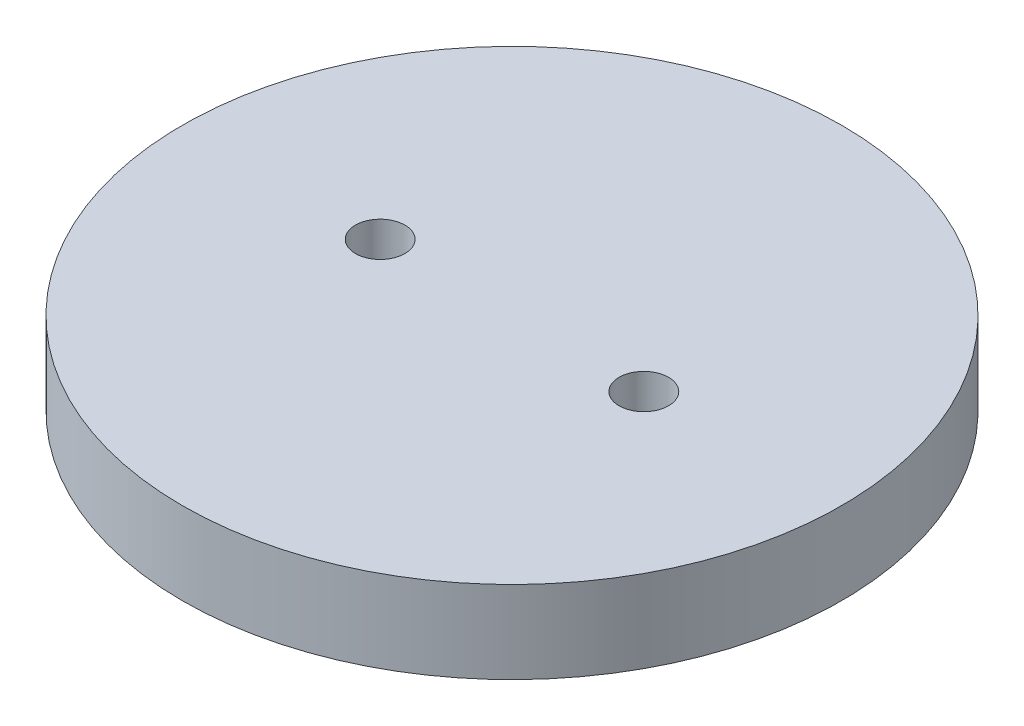
ISO-10303-21;
HEADER;
FILE_DESCRIPTION(('STEP AP214'),'2;1');
FILE_NAME('part.step','',(''),(''),'','','');
FILE_SCHEMA(('AUTOMOTIVE_DESIGN { 1 0 10303 214 1 1 1 1 }'));
ENDSEC;
DATA;
#1=APPLICATION_CONTEXT('core data for automotive mechanical design processes');
#2=APPLICATION_PROTOCOL_DEFINITION('international standard','automotive_design',2000,#1);
#3=PRODUCT_CONTEXT('',#1,'mechanical');
#4=PRODUCT('Part','Part','',(#3));
#5=PRODUCT_RELATED_PRODUCT_CATEGORY('part','',(#4));
#6=PRODUCT_DEFINITION_FORMATION('','',#4);
#7=PRODUCT_DEFINITION_CONTEXT('part definition',#1,'design');
#8=PRODUCT_DEFINITION('design','',#6,#7);
#9=PRODUCT_DEFINITION_SHAPE('','',#8);
#10=(LENGTH_UNIT() NAMED_UNIT(*) SI_UNIT(.MILLI.,.METRE.));
#11=(NAMED_UNIT(*) PLANE_ANGLE_UNIT() SI_UNIT($,.RADIAN.));
#12=(NAMED_UNIT(*) SI_UNIT($,.STERADIAN.) SOLID_ANGLE_UNIT());
#13=UNCERTAINTY_MEASURE_WITH_UNIT(LENGTH_MEASURE(1.E-05),#10,'distance_accuracy_value','');
#14=(GEOMETRIC_REPRESENTATION_CONTEXT(3) GLOBAL_UNCERTAINTY_ASSIGNED_CONTEXT((#13)) GLOBAL_UNIT_ASSIGNED_CONTEXT((#10,
#11,#12)) REPRESENTATION_CONTEXT('',''));
#15=CARTESIAN_POINT('',(0.,0.,0.));
#16=DIRECTION('',(0.,0.,1.));
#17=DIRECTION('',(1.,0.,0.));
#18=AXIS2_PLACEMENT_3D('',#15,#16,#17);
#19=CARTESIAN_POINT('',(0.,5.,0.));
#20=DIRECTION('',(0.,-1.,0.));
#21=DIRECTION('',(0.,0.,-1.));
#22=AXIS2_PLACEMENT_3D('',#19,#20,#21);
#23=CYLINDRICAL_SURFACE('',#22,20.);
#24=CARTESIAN_POINT('',(0.,5.,0.));
#25=DIRECTION('',(0.,1.,0.));
#26=DIRECTION('',(0.,0.,1.));
#27=AXIS2_PLACEMENT_3D('',#24,#25,#26);
#28=CIRCLE('',#27,20.);
#29=CARTESIAN_POINT('',(0.,5.,20.));
#30=VERTEX_POINT('',#29);
#31=EDGE_CURVE('E10',#30,#30,#28,.T.);
#32=ORIENTED_EDGE('',*,*,#31,.F.);
#33=EDGE_LOOP('',(#32));
#34=FACE_BOUND('',#33,.T.);
#35=CARTESIAN_POINT('',(0.,0.,0.));
#36=DIRECTION('',(0.,1.,0.));
#37=DIRECTION('',(0.,0.,1.));
#38=AXIS2_PLACEMENT_3D('',#35,#36,#37);
#39=CIRCLE('',#38,20.);
#40=CARTESIAN_POINT('',(0.,0.,20.));
#41=VERTEX_POINT('',#40);
#42=EDGE_CURVE('E37',#41,#41,#39,.T.);
#43=ORIENTED_EDGE('',*,*,#42,.T.);
#44=EDGE_LOOP('',(#43));
#45=FACE_BOUND('',#44,.T.);
#46=ADVANCED_FACE('F34',(#34,#45),#23,.T.);
#47=CARTESIAN_POINT('',(0.,5.,0.));
#48=DIRECTION('',(0.,1.,0.));
#49=DIRECTION('',(0.,0.,1.));
#50=AXIS2_PLACEMENT_3D('',#47,#48,#49);
#51=PLANE('',#50);
#52=CARTESIAN_POINT('',(8.,5.,0.));
#53=DIRECTION('',(0.,1.,0.));
#54=DIRECTION('',(0.,0.,1.));
#55=AXIS2_PLACEMENT_3D('',#52,#53,#54);
#56=CIRCLE('',#55,1.5);
#57=CARTESIAN_POINT('',(8.,5.,1.5));
#58=VERTEX_POINT('',#57);
#59=EDGE_CURVE('E52',#58,#58,#56,.T.);
#60=ORIENTED_EDGE('',*,*,#59,.F.);
#61=EDGE_LOOP('',(#60));
#62=FACE_BOUND('',#61,.T.);
#63=CARTESIAN_POINT('',(-8.,5.,0.));
#64=DIRECTION('',(0.,1.,0.));
#65=DIRECTION('',(0.,0.,1.));
#66=AXIS2_PLACEMENT_3D('',#63,#64,#65);
#67=CIRCLE('',#66,1.5);
#68=CARTESIAN_POINT('',(-8.,5.,1.49999999999999));
#69=VERTEX_POINT('',#68);
#70=EDGE_CURVE('E46',#69,#69,#67,.T.);
#71=ORIENTED_EDGE('',*,*,#70,.F.);
#72=EDGE_LOOP('',(#71));
#73=FACE_BOUND('',#72,.T.);
#74=ORIENTED_EDGE('',*,*,#31,.T.);
#75=EDGE_LOOP('',(#74));
#76=FACE_BOUND('',#75,.T.);
#77=ADVANCED_FACE('F68',(#62,#73,#76),#51,.T.);
#78=CARTESIAN_POINT('',(0.,0.,0.));
#79=DIRECTION('',(0.,1.,0.));
#80=DIRECTION('',(0.,0.,1.));
#81=AXIS2_PLACEMENT_3D('',#78,#79,#80);
#82=PLANE('',#81);
#83=CARTESIAN_POINT('',(8.,0.,0.));
#84=DIRECTION('',(0.,1.,0.));
#85=DIRECTION('',(0.,0.,1.));
#86=AXIS2_PLACEMENT_3D('',#83,#84,#85);
#87=CIRCLE('',#86,1.5);
#88=CARTESIAN_POINT('',(8.,0.,1.5));
#89=VERTEX_POINT('',#88);
#90=EDGE_CURVE('E44',#89,#89,#87,.T.);
#91=ORIENTED_EDGE('',*,*,#90,.T.);
#92=EDGE_LOOP('',(#91));
#93=FACE_BOUND('',#92,.T.);
#94=CARTESIAN_POINT('',(-8.,0.,0.));
#95=DIRECTION('',(0.,1.,0.));
#96=DIRECTION('',(0.,0.,1.));
#97=AXIS2_PLACEMENT_3D('',#94,#95,#96);
#98=CIRCLE('',#97,1.5);
#99=CARTESIAN_POINT('',(-8.,0.,1.49999999999999));
#100=VERTEX_POINT('',#99);
#101=EDGE_CURVE('E49',#100,#100,#98,.T.);
#102=ORIENTED_EDGE('',*,*,#101,.T.);
#103=EDGE_LOOP('',(#102));
#104=FACE_BOUND('',#103,.T.);
#105=ORIENTED_EDGE('',*,*,#42,.F.);
#106=EDGE_LOOP('',(#105));
#107=FACE_BOUND('',#106,.T.);
#108=ADVANCED_FACE('F58',(#93,#104,#107),#82,.F.);
#109=CARTESIAN_POINT('',(-8.,0.,0.));
#110=DIRECTION('',(0.,1.,0.));
#111=DIRECTION('',(0.,0.,1.));
#112=AXIS2_PLACEMENT_3D('',#109,#110,#111);
#113=CYLINDRICAL_SURFACE('',#112,1.5);
#114=ORIENTED_EDGE('',*,*,#101,.F.);
#115=EDGE_LOOP('',(#114));
#116=FACE_BOUND('',#115,.T.);
#117=ORIENTED_EDGE('',*,*,#70,.T.);
#118=EDGE_LOOP('',(#117));
#119=FACE_BOUND('',#118,.T.);
#120=ADVANCED_FACE('F64',(#116,#119),#113,.F.);
#121=CARTESIAN_POINT('',(8.,0.,0.));
#122=DIRECTION('',(0.,1.,0.));
#123=DIRECTION('',(0.,0.,1.));
#124=AXIS2_PLACEMENT_3D('',#121,#122,#123);
#125=CYLINDRICAL_SURFACE('',#124,1.5);
#126=ORIENTED_EDGE('',*,*,#90,.F.);
#127=EDGE_LOOP('',(#126));
#128=FACE_BOUND('',#127,.T.);
#129=ORIENTED_EDGE('',*,*,#59,.T.);
#130=EDGE_LOOP('',(#129));
#131=FACE_BOUND('',#130,.T.);
#132=ADVANCED_FACE('F61',(#128,#131),#125,.F.);
#133=CLOSED_SHELL('',(#46,#77,#108,#120,#132));
#134=MANIFOLD_SOLID_BREP('B2',#133);
#135=ADVANCED_BREP_SHAPE_REPRESENTATION('',(#18,#134),#14);
#136=SHAPE_DEFINITION_REPRESENTATION(#9,#135);
ENDSEC;
END-ISO-10303-21;
